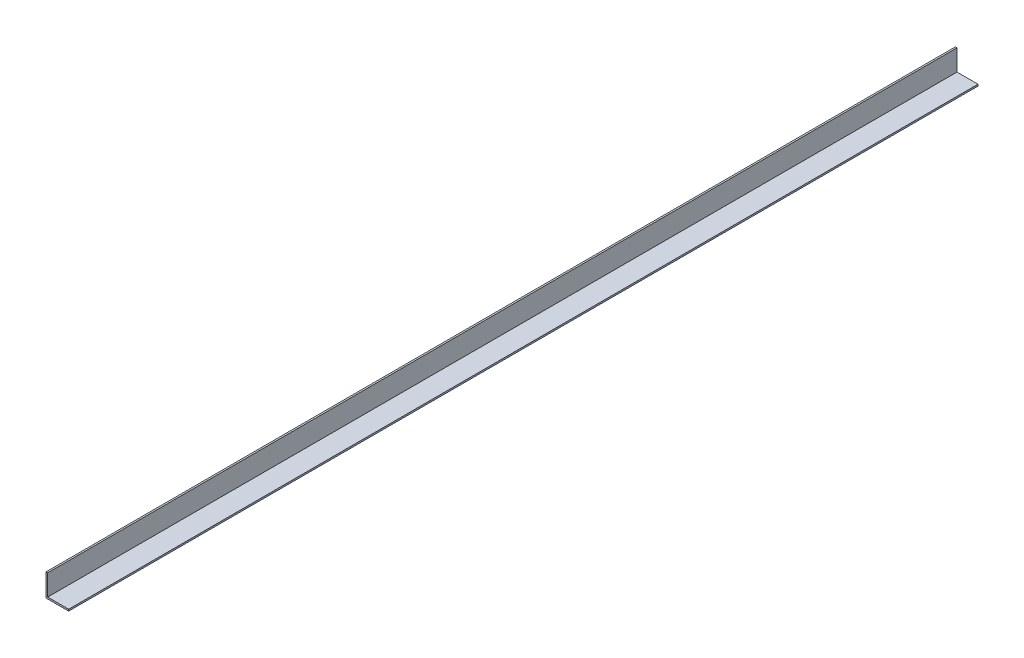
ISO-10303-21;
HEADER;
FILE_DESCRIPTION(('STEP AP214'),'2;1');
FILE_NAME('part.step','',(''),(''),'','','');
FILE_SCHEMA(('AUTOMOTIVE_DESIGN { 1 0 10303 214 1 1 1 1 }'));
ENDSEC;
DATA;
#1=APPLICATION_CONTEXT('core data for automotive mechanical design processes');
#2=APPLICATION_PROTOCOL_DEFINITION('international standard','automotive_design',2000,#1);
#3=PRODUCT_CONTEXT('',#1,'mechanical');
#4=PRODUCT('Part','Part','',(#3));
#5=PRODUCT_RELATED_PRODUCT_CATEGORY('part','',(#4));
#6=PRODUCT_DEFINITION_FORMATION('','',#4);
#7=PRODUCT_DEFINITION_CONTEXT('part definition',#1,'design');
#8=PRODUCT_DEFINITION('design','',#6,#7);
#9=PRODUCT_DEFINITION_SHAPE('','',#8);
#10=(LENGTH_UNIT() NAMED_UNIT(*) SI_UNIT(.MILLI.,.METRE.));
#11=(NAMED_UNIT(*) PLANE_ANGLE_UNIT() SI_UNIT($,.RADIAN.));
#12=(NAMED_UNIT(*) SI_UNIT($,.STERADIAN.) SOLID_ANGLE_UNIT());
#13=UNCERTAINTY_MEASURE_WITH_UNIT(LENGTH_MEASURE(1.E-05),#10,'distance_accuracy_value','');
#14=(GEOMETRIC_REPRESENTATION_CONTEXT(3) GLOBAL_UNCERTAINTY_ASSIGNED_CONTEXT((#13)) GLOBAL_UNIT_ASSIGNED_CONTEXT((#10,
#11,#12)) REPRESENTATION_CONTEXT('',''));
#15=CARTESIAN_POINT('',(0.,0.,0.));
#16=DIRECTION('',(0.,0.,1.));
#17=DIRECTION('',(1.,0.,0.));
#18=AXIS2_PLACEMENT_3D('',#15,#16,#17);
#19=CARTESIAN_POINT('',(11.1,152.,-6100.));
#20=DIRECTION('',(0.,1.,0.));
#21=DIRECTION('',(0.,0.,1.));
#22=AXIS2_PLACEMENT_3D('',#19,#20,#21);
#23=PLANE('',#22);
#24=DIRECTION('',(-1.,0.,0.));
#25=VECTOR('',#24,1.);
#26=CARTESIAN_POINT('',(11.1,152.,0.));
#27=LINE('',#26,#25);
#28=CARTESIAN_POINT('',(11.1,152.,0.));
#29=VERTEX_POINT('',#28);
#30=CARTESIAN_POINT('',(0.,152.,0.));
#31=VERTEX_POINT('',#30);
#32=EDGE_CURVE('E118',#29,#31,#27,.T.);
#33=ORIENTED_EDGE('',*,*,#32,.F.);
#34=DIRECTION('',(0.,0.,1.));
#35=VECTOR('',#34,1.);
#36=CARTESIAN_POINT('',(11.1,152.,-6100.));
#37=LINE('',#36,#35);
#38=CARTESIAN_POINT('',(11.1,152.,-6100.));
#39=VERTEX_POINT('',#38);
#40=EDGE_CURVE('E11',#39,#29,#37,.T.);
#41=ORIENTED_EDGE('',*,*,#40,.F.);
#42=DIRECTION('',(-1.,0.,0.));
#43=VECTOR('',#42,1.);
#44=CARTESIAN_POINT('',(11.1,152.,-6100.));
#45=LINE('',#44,#43);
#46=CARTESIAN_POINT('',(0.,152.,-6100.));
#47=VERTEX_POINT('',#46);
#48=EDGE_CURVE('E132',#39,#47,#45,.T.);
#49=ORIENTED_EDGE('',*,*,#48,.T.);
#50=DIRECTION('',(0.,0.,1.));
#51=VECTOR('',#50,1.);
#52=CARTESIAN_POINT('',(0.,152.,-6100.));
#53=LINE('',#52,#51);
#54=EDGE_CURVE('E36',#47,#31,#53,.T.);
#55=ORIENTED_EDGE('',*,*,#54,.T.);
#56=EDGE_LOOP('',(#33,#41,#49,#55));
#57=FACE_BOUND('',#56,.T.);
#58=ADVANCED_FACE('F33',(#57),#23,.T.);
#59=CARTESIAN_POINT('',(11.1,11.1,-6100.));
#60=DIRECTION('',(1.,0.,0.));
#61=DIRECTION('',(0.,1.,0.));
#62=AXIS2_PLACEMENT_3D('',#59,#60,#61);
#63=PLANE('',#62);
#64=DIRECTION('',(0.,1.,0.));
#65=VECTOR('',#64,1.);
#66=CARTESIAN_POINT('',(11.1,11.1,0.));
#67=LINE('',#66,#65);
#68=CARTESIAN_POINT('',(11.1,11.1,0.));
#69=VERTEX_POINT('',#68);
#70=EDGE_CURVE('E130',#69,#29,#67,.T.);
#71=ORIENTED_EDGE('',*,*,#70,.F.);
#72=DIRECTION('',(0.,0.,1.));
#73=VECTOR('',#72,1.);
#74=CARTESIAN_POINT('',(11.1,11.1,-6100.));
#75=LINE('',#74,#73);
#76=CARTESIAN_POINT('',(11.1,11.1,-6100.));
#77=VERTEX_POINT('',#76);
#78=EDGE_CURVE('E42',#77,#69,#75,.T.);
#79=ORIENTED_EDGE('',*,*,#78,.F.);
#80=DIRECTION('',(0.,1.,0.));
#81=VECTOR('',#80,1.);
#82=CARTESIAN_POINT('',(11.1,11.1,-6100.));
#83=LINE('',#82,#81);
#84=EDGE_CURVE('E108',#77,#39,#83,.T.);
#85=ORIENTED_EDGE('',*,*,#84,.T.);
#86=ORIENTED_EDGE('',*,*,#40,.T.);
#87=EDGE_LOOP('',(#71,#79,#85,#86));
#88=FACE_BOUND('',#87,.T.);
#89=ADVANCED_FACE('F140',(#88),#63,.T.);
#90=CARTESIAN_POINT('',(152.,11.1,-6100.));
#91=DIRECTION('',(0.,1.,0.));
#92=DIRECTION('',(-1.,0.,0.));
#93=AXIS2_PLACEMENT_3D('',#90,#91,#92);
#94=PLANE('',#93);
#95=DIRECTION('',(-1.,0.,0.));
#96=VECTOR('',#95,1.);
#97=CARTESIAN_POINT('',(152.,11.1,0.));
#98=LINE('',#97,#96);
#99=CARTESIAN_POINT('',(152.,11.1,0.));
#100=VERTEX_POINT('',#99);
#101=EDGE_CURVE('E95',#100,#69,#98,.T.);
#102=ORIENTED_EDGE('',*,*,#101,.F.);
#103=DIRECTION('',(0.,0.,1.));
#104=VECTOR('',#103,1.);
#105=CARTESIAN_POINT('',(152.,11.1,-6100.));
#106=LINE('',#105,#104);
#107=CARTESIAN_POINT('',(152.,11.1,-6100.));
#108=VERTEX_POINT('',#107);
#109=EDGE_CURVE('E90',#108,#100,#106,.T.);
#110=ORIENTED_EDGE('',*,*,#109,.F.);
#111=DIRECTION('',(-1.,0.,0.));
#112=VECTOR('',#111,1.);
#113=CARTESIAN_POINT('',(152.,11.1,-6100.));
#114=LINE('',#113,#112);
#115=EDGE_CURVE('E93',#108,#77,#114,.T.);
#116=ORIENTED_EDGE('',*,*,#115,.T.);
#117=ORIENTED_EDGE('',*,*,#78,.T.);
#118=EDGE_LOOP('',(#102,#110,#116,#117));
#119=FACE_BOUND('',#118,.T.);
#120=ADVANCED_FACE('F92',(#119),#94,.T.);
#121=CARTESIAN_POINT('',(152.,0.,-6100.));
#122=DIRECTION('',(1.,0.,0.));
#123=DIRECTION('',(0.,0.,-1.));
#124=AXIS2_PLACEMENT_3D('',#121,#122,#123);
#125=PLANE('',#124);
#126=DIRECTION('',(0.,1.,0.));
#127=VECTOR('',#126,1.);
#128=CARTESIAN_POINT('',(152.,0.,0.));
#129=LINE('',#128,#127);
#130=CARTESIAN_POINT('',(152.,0.,0.));
#131=VERTEX_POINT('',#130);
#132=EDGE_CURVE('E127',#131,#100,#129,.T.);
#133=ORIENTED_EDGE('',*,*,#132,.F.);
#134=DIRECTION('',(0.,0.,1.));
#135=VECTOR('',#134,1.);
#136=CARTESIAN_POINT('',(152.,0.,-6100.));
#137=LINE('',#136,#135);
#138=CARTESIAN_POINT('',(152.,0.,-6100.));
#139=VERTEX_POINT('',#138);
#140=EDGE_CURVE('E100',#139,#131,#137,.T.);
#141=ORIENTED_EDGE('',*,*,#140,.F.);
#142=DIRECTION('',(0.,1.,0.));
#143=VECTOR('',#142,1.);
#144=CARTESIAN_POINT('',(152.,0.,-6100.));
#145=LINE('',#144,#143);
#146=EDGE_CURVE('E106',#139,#108,#145,.T.);
#147=ORIENTED_EDGE('',*,*,#146,.T.);
#148=ORIENTED_EDGE('',*,*,#109,.T.);
#149=EDGE_LOOP('',(#133,#141,#147,#148));
#150=FACE_BOUND('',#149,.T.);
#151=ADVANCED_FACE('F110',(#150),#125,.T.);
#152=CARTESIAN_POINT('',(0.,0.,-6100.));
#153=DIRECTION('',(0.,-1.,0.));
#154=DIRECTION('',(0.,0.,-1.));
#155=AXIS2_PLACEMENT_3D('',#152,#153,#154);
#156=PLANE('',#155);
#157=DIRECTION('',(1.,0.,0.));
#158=VECTOR('',#157,1.);
#159=CARTESIAN_POINT('',(0.,0.,0.));
#160=LINE('',#159,#158);
#161=CARTESIAN_POINT('',(0.,0.,0.));
#162=VERTEX_POINT('',#161);
#163=EDGE_CURVE('E124',#162,#131,#160,.T.);
#164=ORIENTED_EDGE('',*,*,#163,.F.);
#165=DIRECTION('',(0.,0.,1.));
#166=VECTOR('',#165,1.);
#167=CARTESIAN_POINT('',(0.,0.,-6100.));
#168=LINE('',#167,#166);
#169=CARTESIAN_POINT('',(0.,0.,-6100.));
#170=VERTEX_POINT('',#169);
#171=EDGE_CURVE('E135',#170,#162,#168,.T.);
#172=ORIENTED_EDGE('',*,*,#171,.F.);
#173=DIRECTION('',(1.,0.,0.));
#174=VECTOR('',#173,1.);
#175=CARTESIAN_POINT('',(0.,0.,-6100.));
#176=LINE('',#175,#174);
#177=EDGE_CURVE('E111',#170,#139,#176,.T.);
#178=ORIENTED_EDGE('',*,*,#177,.T.);
#179=ORIENTED_EDGE('',*,*,#140,.T.);
#180=EDGE_LOOP('',(#164,#172,#178,#179));
#181=FACE_BOUND('',#180,.T.);
#182=ADVANCED_FACE('F153',(#181),#156,.T.);
#183=CARTESIAN_POINT('',(0.,152.,-6100.));
#184=DIRECTION('',(-1.,0.,0.));
#185=DIRECTION('',(0.,-1.,0.));
#186=AXIS2_PLACEMENT_3D('',#183,#184,#185);
#187=PLANE('',#186);
#188=DIRECTION('',(0.,-1.,0.));
#189=VECTOR('',#188,1.);
#190=CARTESIAN_POINT('',(0.,152.,0.));
#191=LINE('',#190,#189);
#192=EDGE_CURVE('E121',#31,#162,#191,.T.);
#193=ORIENTED_EDGE('',*,*,#192,.F.);
#194=ORIENTED_EDGE('',*,*,#54,.F.);
#195=DIRECTION('',(0.,-1.,0.));
#196=VECTOR('',#195,1.);
#197=CARTESIAN_POINT('',(0.,152.,-6100.));
#198=LINE('',#197,#196);
#199=EDGE_CURVE('E113',#47,#170,#198,.T.);
#200=ORIENTED_EDGE('',*,*,#199,.T.);
#201=ORIENTED_EDGE('',*,*,#171,.T.);
#202=EDGE_LOOP('',(#193,#194,#200,#201));
#203=FACE_BOUND('',#202,.T.);
#204=ADVANCED_FACE('F137',(#203),#187,.T.);
#205=CARTESIAN_POINT('',(0.,0.,-6100.));
#206=DIRECTION('',(0.,0.,1.));
#207=DIRECTION('',(1.,0.,0.));
#208=AXIS2_PLACEMENT_3D('',#205,#206,#207);
#209=PLANE('',#208);
#210=ORIENTED_EDGE('',*,*,#48,.F.);
#211=ORIENTED_EDGE('',*,*,#84,.F.);
#212=ORIENTED_EDGE('',*,*,#115,.F.);
#213=ORIENTED_EDGE('',*,*,#146,.F.);
#214=ORIENTED_EDGE('',*,*,#177,.F.);
#215=ORIENTED_EDGE('',*,*,#199,.F.);
#216=EDGE_LOOP('',(#210,#211,#212,#213,#214,#215));
#217=FACE_BOUND('',#216,.T.);
#218=ADVANCED_FACE('F104',(#217),#209,.F.);
#219=CARTESIAN_POINT('',(0.,0.,0.));
#220=DIRECTION('',(0.,0.,1.));
#221=DIRECTION('',(1.,0.,0.));
#222=AXIS2_PLACEMENT_3D('',#219,#220,#221);
#223=PLANE('',#222);
#224=ORIENTED_EDGE('',*,*,#32,.T.);
#225=ORIENTED_EDGE('',*,*,#192,.T.);
#226=ORIENTED_EDGE('',*,*,#163,.T.);
#227=ORIENTED_EDGE('',*,*,#132,.T.);
#228=ORIENTED_EDGE('',*,*,#101,.T.);
#229=ORIENTED_EDGE('',*,*,#70,.T.);
#230=EDGE_LOOP('',(#224,#225,#226,#227,#228,#229));
#231=FACE_BOUND('',#230,.T.);
#232=ADVANCED_FACE('F139',(#231),#223,.T.);
#233=CLOSED_SHELL('',(#58,#89,#120,#151,#182,#204,#218,#232));
#234=MANIFOLD_SOLID_BREP('B2',#233);
#235=ADVANCED_BREP_SHAPE_REPRESENTATION('',(#18,#234),#14);
#236=SHAPE_DEFINITION_REPRESENTATION(#9,#235);
ENDSEC;
END-ISO-10303-21;
